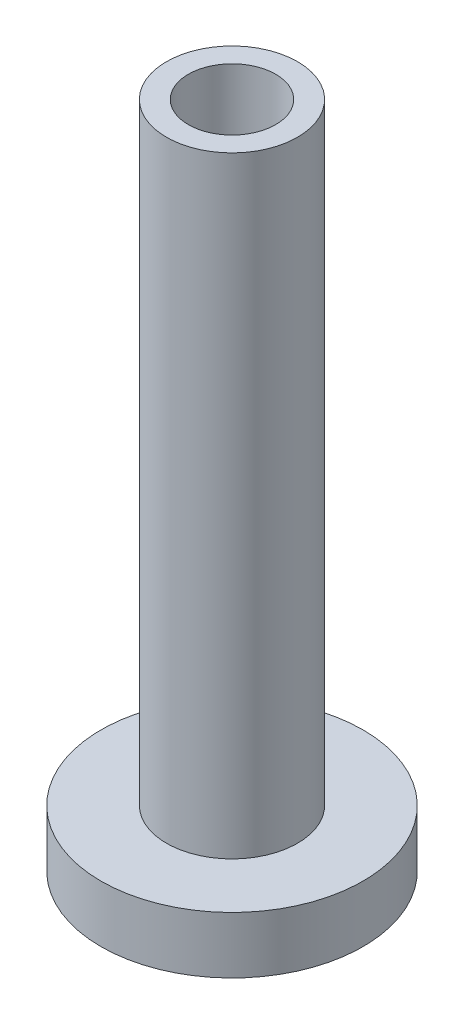
ISO-10303-21;
HEADER;
FILE_DESCRIPTION(('STEP AP214'),'2;1');
FILE_NAME('part.step','',(''),(''),'','','');
FILE_SCHEMA(('AUTOMOTIVE_DESIGN { 1 0 10303 214 1 1 1 1 }'));
ENDSEC;
DATA;
#1=APPLICATION_CONTEXT('core data for automotive mechanical design processes');
#2=APPLICATION_PROTOCOL_DEFINITION('international standard','automotive_design',2000,#1);
#3=PRODUCT_CONTEXT('',#1,'mechanical');
#4=PRODUCT('Part','Part','',(#3));
#5=PRODUCT_RELATED_PRODUCT_CATEGORY('part','',(#4));
#6=PRODUCT_DEFINITION_FORMATION('','',#4);
#7=PRODUCT_DEFINITION_CONTEXT('part definition',#1,'design');
#8=PRODUCT_DEFINITION('design','',#6,#7);
#9=PRODUCT_DEFINITION_SHAPE('','',#8);
#10=(LENGTH_UNIT() NAMED_UNIT(*) SI_UNIT(.MILLI.,.METRE.));
#11=(NAMED_UNIT(*) PLANE_ANGLE_UNIT() SI_UNIT($,.RADIAN.));
#12=(NAMED_UNIT(*) SI_UNIT($,.STERADIAN.) SOLID_ANGLE_UNIT());
#13=UNCERTAINTY_MEASURE_WITH_UNIT(LENGTH_MEASURE(1.E-05),#10,'distance_accuracy_value','');
#14=(GEOMETRIC_REPRESENTATION_CONTEXT(3) GLOBAL_UNCERTAINTY_ASSIGNED_CONTEXT((#13)) GLOBAL_UNIT_ASSIGNED_CONTEXT((#10,
#11,#12)) REPRESENTATION_CONTEXT('',''));
#15=CARTESIAN_POINT('',(0.,0.,0.));
#16=DIRECTION('',(0.,0.,1.));
#17=DIRECTION('',(1.,0.,0.));
#18=AXIS2_PLACEMENT_3D('',#15,#16,#17);
#19=CARTESIAN_POINT('',(0.,0.,0.));
#20=DIRECTION('',(0.,1.,0.));
#21=DIRECTION('',(0.,0.,-1.));
#22=AXIS2_PLACEMENT_3D('',#19,#20,#21);
#23=PLANE('',#22);
#24=CARTESIAN_POINT('',(0.,0.,0.));
#25=DIRECTION('',(0.,-1.,0.));
#26=DIRECTION('',(0.,0.,-1.));
#27=AXIS2_PLACEMENT_3D('',#24,#25,#26);
#28=CIRCLE('',#27,3.);
#29=CARTESIAN_POINT('',(0.,0.,-3.));
#30=VERTEX_POINT('',#29);
#31=EDGE_CURVE('E147',#30,#30,#28,.T.);
#32=ORIENTED_EDGE('',*,*,#31,.T.);
#33=EDGE_LOOP('',(#32));
#34=FACE_BOUND('',#33,.T.);
#35=DIRECTION('',(1.,0.,0.));
#36=VECTOR('',#35,1.);
#37=CARTESIAN_POINT('',(0.,0.,-1.));
#38=LINE('',#37,#36);
#39=CARTESIAN_POINT('',(-0.577350269189626,0.,-1.));
#40=VERTEX_POINT('',#39);
#41=CARTESIAN_POINT('',(0.577350269189626,0.,-1.));
#42=VERTEX_POINT('',#41);
#43=EDGE_CURVE('E223',#40,#42,#38,.T.);
#44=ORIENTED_EDGE('',*,*,#43,.F.);
#45=DIRECTION('',(0.5,0.,-0.866025403784439));
#46=VECTOR('',#45,1.);
#47=CARTESIAN_POINT('',(-0.866025403784439,0.,-0.5));
#48=LINE('',#47,#46);
#49=CARTESIAN_POINT('',(-1.15470053837925,0.,0.));
#50=VERTEX_POINT('',#49);
#51=EDGE_CURVE('E228',#50,#40,#48,.T.);
#52=ORIENTED_EDGE('',*,*,#51,.F.);
#53=DIRECTION('',(-0.5,0.,-0.866025403784439));
#54=VECTOR('',#53,1.);
#55=CARTESIAN_POINT('',(-0.866025403784439,0.,0.5));
#56=LINE('',#55,#54);
#57=CARTESIAN_POINT('',(-0.577350269189626,0.,1.));
#58=VERTEX_POINT('',#57);
#59=EDGE_CURVE('E245',#58,#50,#56,.T.);
#60=ORIENTED_EDGE('',*,*,#59,.F.);
#61=DIRECTION('',(-1.,0.,0.));
#62=VECTOR('',#61,1.);
#63=CARTESIAN_POINT('',(0.,0.,1.));
#64=LINE('',#63,#62);
#65=CARTESIAN_POINT('',(0.577350269189626,0.,1.));
#66=VERTEX_POINT('',#65);
#67=EDGE_CURVE('E129',#66,#58,#64,.T.);
#68=ORIENTED_EDGE('',*,*,#67,.F.);
#69=DIRECTION('',(-0.5,0.,0.866025403784438));
#70=VECTOR('',#69,1.);
#71=CARTESIAN_POINT('',(0.866025403784438,0.,0.5));
#72=LINE('',#71,#70);
#73=CARTESIAN_POINT('',(1.15470053837925,0.,0.));
#74=VERTEX_POINT('',#73);
#75=EDGE_CURVE('E239',#74,#66,#72,.T.);
#76=ORIENTED_EDGE('',*,*,#75,.F.);
#77=DIRECTION('',(0.5,0.,0.866025403784439));
#78=VECTOR('',#77,1.);
#79=CARTESIAN_POINT('',(0.866025403784439,0.,-0.5));
#80=LINE('',#79,#78);
#81=EDGE_CURVE('E235',#42,#74,#80,.T.);
#82=ORIENTED_EDGE('',*,*,#81,.F.);
#83=EDGE_LOOP('',(#44,#52,#60,#68,#76,#82));
#84=FACE_BOUND('',#83,.T.);
#85=ADVANCED_FACE('F49',(#34,#84),#23,.F.);
#86=CARTESIAN_POINT('',(0.,1.3,0.));
#87=DIRECTION('',(0.,-1.,0.));
#88=DIRECTION('',(0.,0.,1.));
#89=AXIS2_PLACEMENT_3D('',#86,#87,#88);
#90=CYLINDRICAL_SURFACE('',#89,3.);
#91=CARTESIAN_POINT('',(0.,1.3,0.));
#92=DIRECTION('',(0.,-1.,0.));
#93=DIRECTION('',(0.,0.,-1.));
#94=AXIS2_PLACEMENT_3D('',#91,#92,#93);
#95=CIRCLE('',#94,3.);
#96=CARTESIAN_POINT('',(0.,1.3,-3.));
#97=VERTEX_POINT('',#96);
#98=EDGE_CURVE('E58',#97,#97,#95,.T.);
#99=ORIENTED_EDGE('',*,*,#98,.T.);
#100=EDGE_LOOP('',(#99));
#101=FACE_BOUND('',#100,.T.);
#102=ORIENTED_EDGE('',*,*,#31,.F.);
#103=EDGE_LOOP('',(#102));
#104=FACE_BOUND('',#103,.T.);
#105=ADVANCED_FACE('F51',(#101,#104),#90,.T.);
#106=CARTESIAN_POINT('',(0.,1.3,0.));
#107=DIRECTION('',(0.,1.,0.));
#108=DIRECTION('',(0.,0.,-1.));
#109=AXIS2_PLACEMENT_3D('',#106,#107,#108);
#110=PLANE('',#109);
#111=CARTESIAN_POINT('',(0.,1.3,0.));
#112=DIRECTION('',(0.,-1.,0.));
#113=DIRECTION('',(0.,0.,-1.));
#114=AXIS2_PLACEMENT_3D('',#111,#112,#113);
#115=CIRCLE('',#114,1.5);
#116=CARTESIAN_POINT('',(0.,1.3,-1.5));
#117=VERTEX_POINT('',#116);
#118=EDGE_CURVE('E212',#117,#117,#115,.T.);
#119=ORIENTED_EDGE('',*,*,#118,.T.);
#120=EDGE_LOOP('',(#119));
#121=FACE_BOUND('',#120,.T.);
#122=ORIENTED_EDGE('',*,*,#98,.F.);
#123=EDGE_LOOP('',(#122));
#124=FACE_BOUND('',#123,.T.);
#125=ADVANCED_FACE('F157',(#121,#124),#110,.T.);
#126=CARTESIAN_POINT('',(0.,0.6,-1.));
#127=DIRECTION('',(0.,0.,1.));
#128=DIRECTION('',(-1.,0.,0.));
#129=AXIS2_PLACEMENT_3D('',#126,#127,#128);
#130=PLANE('',#129);
#131=ORIENTED_EDGE('',*,*,#43,.T.);
#132=DIRECTION('',(0.,-1.,0.));
#133=VECTOR('',#132,1.);
#134=CARTESIAN_POINT('',(0.577350269189626,0.6,-1.));
#135=LINE('',#134,#133);
#136=CARTESIAN_POINT('',(0.577350269189626,0.6,-1.));
#137=VERTEX_POINT('',#136);
#138=EDGE_CURVE('E144',#137,#42,#135,.T.);
#139=ORIENTED_EDGE('',*,*,#138,.F.);
#140=DIRECTION('',(1.,0.,0.));
#141=VECTOR('',#140,1.);
#142=CARTESIAN_POINT('',(0.,0.6,-1.));
#143=LINE('',#142,#141);
#144=CARTESIAN_POINT('',(-0.577350269189626,0.6,-1.));
#145=VERTEX_POINT('',#144);
#146=EDGE_CURVE('E225',#145,#137,#143,.T.);
#147=ORIENTED_EDGE('',*,*,#146,.F.);
#148=DIRECTION('',(0.,-1.,0.));
#149=VECTOR('',#148,1.);
#150=CARTESIAN_POINT('',(-0.577350269189626,0.6,-1.));
#151=LINE('',#150,#149);
#152=EDGE_CURVE('E65',#145,#40,#151,.T.);
#153=ORIENTED_EDGE('',*,*,#152,.T.);
#154=EDGE_LOOP('',(#131,#139,#147,#153));
#155=FACE_BOUND('',#154,.T.);
#156=ADVANCED_FACE('F163',(#155),#130,.T.);
#157=CARTESIAN_POINT('',(0.866025403784439,0.6,-0.5));
#158=DIRECTION('',(-0.866025403784439,0.,0.5));
#159=DIRECTION('',(-0.5,0.,-0.866025403784439));
#160=AXIS2_PLACEMENT_3D('',#157,#158,#159);
#161=PLANE('',#160);
#162=ORIENTED_EDGE('',*,*,#81,.T.);
#163=DIRECTION('',(0.,-1.,0.));
#164=VECTOR('',#163,1.);
#165=CARTESIAN_POINT('',(1.15470053837925,0.6,0.));
#166=LINE('',#165,#164);
#167=CARTESIAN_POINT('',(1.15470053837925,0.6,0.));
#168=VERTEX_POINT('',#167);
#169=EDGE_CURVE('E136',#168,#74,#166,.T.);
#170=ORIENTED_EDGE('',*,*,#169,.F.);
#171=DIRECTION('',(0.5,0.,0.866025403784439));
#172=VECTOR('',#171,1.);
#173=CARTESIAN_POINT('',(0.866025403784439,0.6,-0.5));
#174=LINE('',#173,#172);
#175=EDGE_CURVE('E103',#137,#168,#174,.T.);
#176=ORIENTED_EDGE('',*,*,#175,.F.);
#177=ORIENTED_EDGE('',*,*,#138,.T.);
#178=EDGE_LOOP('',(#162,#170,#176,#177));
#179=FACE_BOUND('',#178,.T.);
#180=ADVANCED_FACE('F174',(#179),#161,.T.);
#181=CARTESIAN_POINT('',(0.866025403784438,0.6,0.5));
#182=DIRECTION('',(-0.866025403784438,0.,-0.5));
#183=DIRECTION('',(0.5,0.,-0.866025403784439));
#184=AXIS2_PLACEMENT_3D('',#181,#182,#183);
#185=PLANE('',#184);
#186=ORIENTED_EDGE('',*,*,#75,.T.);
#187=DIRECTION('',(0.,-1.,0.));
#188=VECTOR('',#187,1.);
#189=CARTESIAN_POINT('',(0.577350269189626,0.6,1.));
#190=LINE('',#189,#188);
#191=CARTESIAN_POINT('',(0.577350269189626,0.6,1.));
#192=VERTEX_POINT('',#191);
#193=EDGE_CURVE('E132',#192,#66,#190,.T.);
#194=ORIENTED_EDGE('',*,*,#193,.F.);
#195=DIRECTION('',(-0.5,0.,0.866025403784438));
#196=VECTOR('',#195,1.);
#197=CARTESIAN_POINT('',(0.866025403784438,0.6,0.5));
#198=LINE('',#197,#196);
#199=EDGE_CURVE('E122',#168,#192,#198,.T.);
#200=ORIENTED_EDGE('',*,*,#199,.F.);
#201=ORIENTED_EDGE('',*,*,#169,.T.);
#202=EDGE_LOOP('',(#186,#194,#200,#201));
#203=FACE_BOUND('',#202,.T.);
#204=ADVANCED_FACE('F177',(#203),#185,.T.);
#205=CARTESIAN_POINT('',(0.,0.6,1.));
#206=DIRECTION('',(0.,0.,-1.));
#207=DIRECTION('',(1.,0.,0.));
#208=AXIS2_PLACEMENT_3D('',#205,#206,#207);
#209=PLANE('',#208);
#210=ORIENTED_EDGE('',*,*,#67,.T.);
#211=DIRECTION('',(0.,-1.,0.));
#212=VECTOR('',#211,1.);
#213=CARTESIAN_POINT('',(-0.577350269189626,0.6,1.));
#214=LINE('',#213,#212);
#215=CARTESIAN_POINT('',(-0.577350269189626,0.6,1.));
#216=VERTEX_POINT('',#215);
#217=EDGE_CURVE('E115',#216,#58,#214,.T.);
#218=ORIENTED_EDGE('',*,*,#217,.F.);
#219=DIRECTION('',(-1.,0.,0.));
#220=VECTOR('',#219,1.);
#221=CARTESIAN_POINT('',(0.,0.6,1.));
#222=LINE('',#221,#220);
#223=EDGE_CURVE('E118',#192,#216,#222,.T.);
#224=ORIENTED_EDGE('',*,*,#223,.F.);
#225=ORIENTED_EDGE('',*,*,#193,.T.);
#226=EDGE_LOOP('',(#210,#218,#224,#225));
#227=FACE_BOUND('',#226,.T.);
#228=ADVANCED_FACE('F127',(#227),#209,.T.);
#229=CARTESIAN_POINT('',(-0.866025403784439,0.6,0.5));
#230=DIRECTION('',(0.866025403784439,0.,-0.5));
#231=DIRECTION('',(0.5,0.,0.866025403784439));
#232=AXIS2_PLACEMENT_3D('',#229,#230,#231);
#233=PLANE('',#232);
#234=ORIENTED_EDGE('',*,*,#59,.T.);
#235=DIRECTION('',(0.,-1.,0.));
#236=VECTOR('',#235,1.);
#237=CARTESIAN_POINT('',(-1.15470053837925,0.6,0.));
#238=LINE('',#237,#236);
#239=CARTESIAN_POINT('',(-1.15470053837925,0.6,0.));
#240=VERTEX_POINT('',#239);
#241=EDGE_CURVE('E95',#240,#50,#238,.T.);
#242=ORIENTED_EDGE('',*,*,#241,.F.);
#243=DIRECTION('',(-0.5,0.,-0.866025403784439));
#244=VECTOR('',#243,1.);
#245=CARTESIAN_POINT('',(-0.866025403784439,0.6,0.5));
#246=LINE('',#245,#244);
#247=EDGE_CURVE('E111',#216,#240,#246,.T.);
#248=ORIENTED_EDGE('',*,*,#247,.F.);
#249=ORIENTED_EDGE('',*,*,#217,.T.);
#250=EDGE_LOOP('',(#234,#242,#248,#249));
#251=FACE_BOUND('',#250,.T.);
#252=ADVANCED_FACE('F113',(#251),#233,.T.);
#253=CARTESIAN_POINT('',(-0.866025403784439,0.6,-0.5));
#254=DIRECTION('',(0.866025403784438,0.,0.5));
#255=DIRECTION('',(-0.5,0.,0.866025403784439));
#256=AXIS2_PLACEMENT_3D('',#253,#254,#255);
#257=PLANE('',#256);
#258=ORIENTED_EDGE('',*,*,#51,.T.);
#259=ORIENTED_EDGE('',*,*,#152,.F.);
#260=DIRECTION('',(0.5,0.,-0.866025403784439));
#261=VECTOR('',#260,1.);
#262=CARTESIAN_POINT('',(-0.866025403784439,0.6,-0.5));
#263=LINE('',#262,#261);
#264=EDGE_CURVE('E74',#240,#145,#263,.T.);
#265=ORIENTED_EDGE('',*,*,#264,.F.);
#266=ORIENTED_EDGE('',*,*,#241,.T.);
#267=EDGE_LOOP('',(#258,#259,#265,#266));
#268=FACE_BOUND('',#267,.T.);
#269=ADVANCED_FACE('F185',(#268),#257,.T.);
#270=CARTESIAN_POINT('',(0.,0.6,0.));
#271=DIRECTION('',(0.,1.,0.));
#272=DIRECTION('',(0.,0.,-1.));
#273=AXIS2_PLACEMENT_3D('',#270,#271,#272);
#274=PLANE('',#273);
#275=ORIENTED_EDGE('',*,*,#146,.T.);
#276=ORIENTED_EDGE('',*,*,#175,.T.);
#277=ORIENTED_EDGE('',*,*,#199,.T.);
#278=ORIENTED_EDGE('',*,*,#223,.T.);
#279=ORIENTED_EDGE('',*,*,#247,.T.);
#280=ORIENTED_EDGE('',*,*,#264,.T.);
#281=EDGE_LOOP('',(#275,#276,#277,#278,#279,#280));
#282=FACE_BOUND('',#281,.T.);
#283=ADVANCED_FACE('F121',(#282),#274,.F.);
#284=CARTESIAN_POINT('',(0.,15.3,0.));
#285=DIRECTION('',(0.,1.,0.));
#286=DIRECTION('',(0.,0.,-1.));
#287=AXIS2_PLACEMENT_3D('',#284,#285,#286);
#288=PLANE('',#287);
#289=CARTESIAN_POINT('',(0.,15.3,0.));
#290=DIRECTION('',(0.,-1.,0.));
#291=DIRECTION('',(0.,0.,-1.));
#292=AXIS2_PLACEMENT_3D('',#289,#290,#291);
#293=CIRCLE('',#292,1.5);
#294=CARTESIAN_POINT('',(0.,15.3,-1.5));
#295=VERTEX_POINT('',#294);
#296=EDGE_CURVE('E218',#295,#295,#293,.T.);
#297=ORIENTED_EDGE('',*,*,#296,.F.);
#298=EDGE_LOOP('',(#297));
#299=FACE_BOUND('',#298,.T.);
#300=CARTESIAN_POINT('',(0.,15.3,0.));
#301=DIRECTION('',(0.,-1.,0.));
#302=DIRECTION('',(0.,0.,-1.));
#303=AXIS2_PLACEMENT_3D('',#300,#301,#302);
#304=CIRCLE('',#303,1.);
#305=CARTESIAN_POINT('',(0.,15.3,-1.));
#306=VERTEX_POINT('',#305);
#307=EDGE_CURVE('E208',#306,#306,#304,.T.);
#308=ORIENTED_EDGE('',*,*,#307,.T.);
#309=EDGE_LOOP('',(#308));
#310=FACE_BOUND('',#309,.T.);
#311=ADVANCED_FACE('F190',(#299,#310),#288,.T.);
#312=CARTESIAN_POINT('',(0.,15.3,0.));
#313=DIRECTION('',(0.,-1.,0.));
#314=DIRECTION('',(0.,0.,1.));
#315=AXIS2_PLACEMENT_3D('',#312,#313,#314);
#316=CYLINDRICAL_SURFACE('',#315,1.5);
#317=ORIENTED_EDGE('',*,*,#296,.T.);
#318=EDGE_LOOP('',(#317));
#319=FACE_BOUND('',#318,.T.);
#320=ORIENTED_EDGE('',*,*,#118,.F.);
#321=EDGE_LOOP('',(#320));
#322=FACE_BOUND('',#321,.T.);
#323=ADVANCED_FACE('F191',(#319,#322),#316,.T.);
#324=CARTESIAN_POINT('',(0.,15.3,0.));
#325=DIRECTION('',(0.,-1.,0.));
#326=DIRECTION('',(0.,0.,1.));
#327=AXIS2_PLACEMENT_3D('',#324,#325,#326);
#328=CYLINDRICAL_SURFACE('',#327,1.);
#329=ORIENTED_EDGE('',*,*,#307,.F.);
#330=EDGE_LOOP('',(#329));
#331=FACE_BOUND('',#330,.T.);
#332=CARTESIAN_POINT('',(0.,1.3,0.));
#333=DIRECTION('',(0.,-1.,0.));
#334=DIRECTION('',(0.,0.,-1.));
#335=AXIS2_PLACEMENT_3D('',#332,#333,#334);
#336=CIRCLE('',#335,1.);
#337=CARTESIAN_POINT('',(0.,1.3,-1.));
#338=VERTEX_POINT('',#337);
#339=EDGE_CURVE('E11',#338,#338,#336,.F.);
#340=ORIENTED_EDGE('',*,*,#339,.F.);
#341=EDGE_LOOP('',(#340));
#342=FACE_BOUND('',#341,.T.);
#343=ADVANCED_FACE('F194',(#331,#342),#328,.F.);
#344=ORIENTED_EDGE('',*,*,#339,.T.);
#345=EDGE_LOOP('',(#344));
#346=FACE_BOUND('',#345,.T.);
#347=ADVANCED_FACE('F166',(#346),#110,.T.);
#348=CLOSED_SHELL('',(#85,#105,#125,#156,#180,#204,#228,#252,#269,#283,#311,#323,#343,#347));
#349=MANIFOLD_SOLID_BREP('B2',#348);
#350=ADVANCED_BREP_SHAPE_REPRESENTATION('',(#18,#349),#14);
#351=SHAPE_DEFINITION_REPRESENTATION(#9,#350);
ENDSEC;
END-ISO-10303-21;
